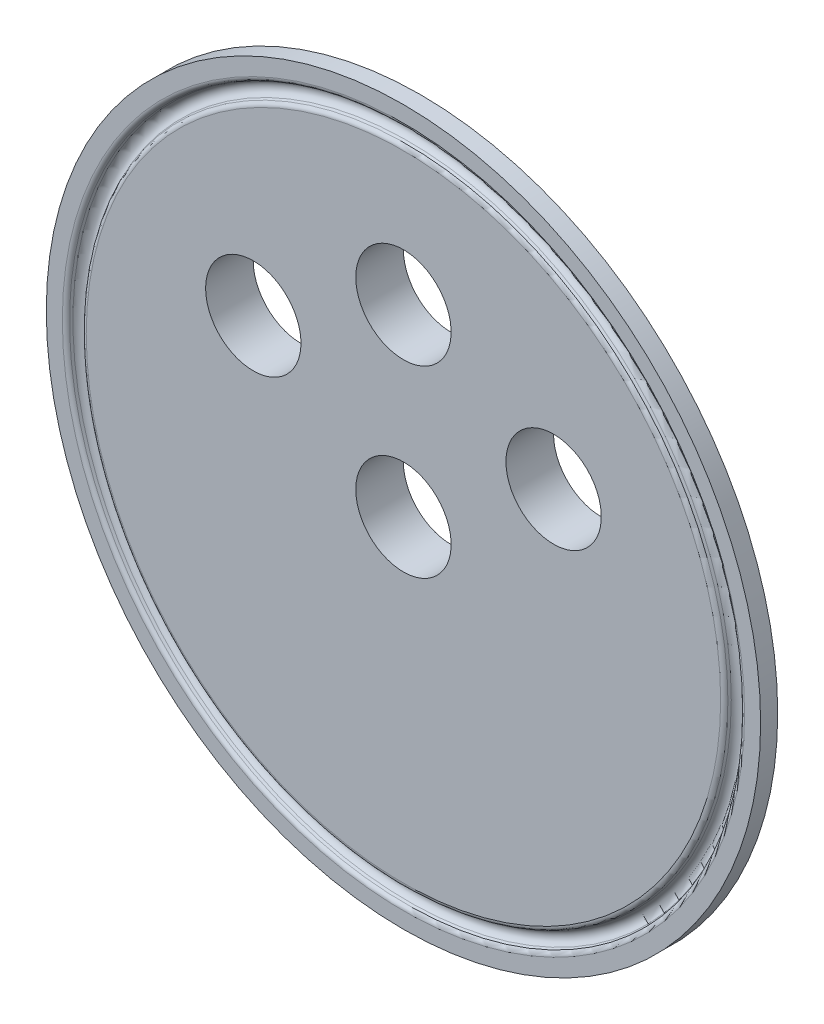
ISO-10303-21;
HEADER;
FILE_DESCRIPTION(('STEP AP214'),'2;1');
FILE_NAME('part.step','',(''),(''),'','','');
FILE_SCHEMA(('AUTOMOTIVE_DESIGN { 1 0 10303 214 1 1 1 1 }'));
ENDSEC;
DATA;
#1=APPLICATION_CONTEXT('core data for automotive mechanical design processes');
#2=APPLICATION_PROTOCOL_DEFINITION('international standard','automotive_design',2000,#1);
#3=PRODUCT_CONTEXT('',#1,'mechanical');
#4=PRODUCT('Part','Part','',(#3));
#5=PRODUCT_RELATED_PRODUCT_CATEGORY('part','',(#4));
#6=PRODUCT_DEFINITION_FORMATION('','',#4);
#7=PRODUCT_DEFINITION_CONTEXT('part definition',#1,'design');
#8=PRODUCT_DEFINITION('design','',#6,#7);
#9=PRODUCT_DEFINITION_SHAPE('','',#8);
#10=(LENGTH_UNIT() NAMED_UNIT(*) SI_UNIT(.MILLI.,.METRE.));
#11=(NAMED_UNIT(*) PLANE_ANGLE_UNIT() SI_UNIT($,.RADIAN.));
#12=(NAMED_UNIT(*) SI_UNIT($,.STERADIAN.) SOLID_ANGLE_UNIT());
#13=UNCERTAINTY_MEASURE_WITH_UNIT(LENGTH_MEASURE(1.E-05),#10,'distance_accuracy_value','');
#14=(GEOMETRIC_REPRESENTATION_CONTEXT(3) GLOBAL_UNCERTAINTY_ASSIGNED_CONTEXT((#13)) GLOBAL_UNIT_ASSIGNED_CONTEXT((#10,
#11,#12)) REPRESENTATION_CONTEXT('',''));
#15=CARTESIAN_POINT('',(0.,0.,0.));
#16=DIRECTION('',(0.,0.,1.));
#17=DIRECTION('',(1.,0.,0.));
#18=AXIS2_PLACEMENT_3D('',#15,#16,#17);
#19=CARTESIAN_POINT('',(0.,45.5042147091706,-7.9248));
#20=DIRECTION('',(0.,0.,1.));
#21=DIRECTION('',(1.,0.,0.));
#22=AXIS2_PLACEMENT_3D('',#19,#20,#21);
#23=PLANE('',#22);
#24=CARTESIAN_POINT('',(25.,16.5,-7.9248));
#25=DIRECTION('',(0.,0.,-1.));
#26=DIRECTION('',(-1.,0.,0.));
#27=AXIS2_PLACEMENT_3D('',#24,#25,#26);
#28=CIRCLE('',#27,7.9375);
#29=CARTESIAN_POINT('',(17.0625,16.5,-7.9248));
#30=VERTEX_POINT('',#29);
#31=EDGE_CURVE('E98',#30,#30,#28,.T.);
#32=ORIENTED_EDGE('',*,*,#31,.F.);
#33=EDGE_LOOP('',(#32));
#34=FACE_BOUND('',#33,.T.);
#35=CARTESIAN_POINT('',(0.,0.,-7.9248));
#36=DIRECTION('',(0.,0.,-1.));
#37=DIRECTION('',(-1.,0.,0.));
#38=AXIS2_PLACEMENT_3D('',#35,#36,#37);
#39=CIRCLE('',#38,7.9375);
#40=CARTESIAN_POINT('',(-7.9375,0.,-7.9248));
#41=VERTEX_POINT('',#40);
#42=EDGE_CURVE('E106',#41,#41,#39,.T.);
#43=ORIENTED_EDGE('',*,*,#42,.F.);
#44=EDGE_LOOP('',(#43));
#45=FACE_BOUND('',#44,.T.);
#46=CARTESIAN_POINT('',(-25.,16.5,-7.9248));
#47=DIRECTION('',(0.,0.,-1.));
#48=DIRECTION('',(-1.,0.,0.));
#49=AXIS2_PLACEMENT_3D('',#46,#47,#48);
#50=CIRCLE('',#49,7.9375);
#51=CARTESIAN_POINT('',(-32.9375,16.5,-7.9248));
#52=VERTEX_POINT('',#51);
#53=EDGE_CURVE('E90',#52,#52,#50,.T.);
#54=ORIENTED_EDGE('',*,*,#53,.F.);
#55=EDGE_LOOP('',(#54));
#56=FACE_BOUND('',#55,.T.);
#57=CARTESIAN_POINT('',(0.,30.6,-7.9248));
#58=DIRECTION('',(0.,0.,-1.));
#59=DIRECTION('',(-1.,0.,0.));
#60=AXIS2_PLACEMENT_3D('',#57,#58,#59);
#61=CIRCLE('',#60,7.9375);
#62=CARTESIAN_POINT('',(-7.9375,30.6,-7.9248));
#63=VERTEX_POINT('',#62);
#64=EDGE_CURVE('E86',#63,#63,#61,.T.);
#65=ORIENTED_EDGE('',*,*,#64,.F.);
#66=EDGE_LOOP('',(#65));
#67=FACE_BOUND('',#66,.T.);
#68=CARTESIAN_POINT('',(0.,0.,-7.9248));
#69=DIRECTION('',(0.,0.,1.));
#70=DIRECTION('',(1.,0.,0.));
#71=AXIS2_PLACEMENT_3D('',#68,#69,#70);
#72=CIRCLE('',#71,45.5042147091706);
#73=CARTESIAN_POINT('',(45.5042147091706,0.,-7.9248));
#74=VERTEX_POINT('',#73);
#75=EDGE_CURVE('E10',#74,#74,#72,.T.);
#76=ORIENTED_EDGE('',*,*,#75,.F.);
#77=EDGE_LOOP('',(#76));
#78=FACE_BOUND('',#77,.T.);
#79=ADVANCED_FACE('F42',(#34,#45,#56,#67,#78),#23,.F.);
#80=CARTESIAN_POINT('',(0.,0.,-7.9248));
#81=DIRECTION('',(0.,0.,1.));
#82=DIRECTION('',(1.,0.,0.));
#83=AXIS2_PLACEMENT_3D('',#80,#81,#82);
#84=CONICAL_SURFACE('',#83,45.5042147091706,1.22173047639603);
#85=CARTESIAN_POINT('',(0.,0.,-2.8448));
#86=DIRECTION('',(0.,0.,1.));
#87=DIRECTION('',(1.,0.,0.));
#88=AXIS2_PLACEMENT_3D('',#85,#86,#87);
#89=CIRCLE('',#88,59.4614);
#90=CARTESIAN_POINT('',(59.4614,0.,-2.8448));
#91=VERTEX_POINT('',#90);
#92=EDGE_CURVE('E49',#91,#91,#89,.T.);
#93=ORIENTED_EDGE('',*,*,#92,.F.);
#94=EDGE_LOOP('',(#93));
#95=FACE_BOUND('',#94,.T.);
#96=ORIENTED_EDGE('',*,*,#75,.T.);
#97=EDGE_LOOP('',(#96));
#98=FACE_BOUND('',#97,.T.);
#99=ADVANCED_FACE('F122',(#95,#98),#84,.T.);
#100=CARTESIAN_POINT('',(0.,0.,0.));
#101=DIRECTION('',(0.,0.,1.));
#102=DIRECTION('',(1.,0.,0.));
#103=AXIS2_PLACEMENT_3D('',#100,#101,#102);
#104=CYLINDRICAL_SURFACE('',#103,59.4614);
#105=CARTESIAN_POINT('',(0.,0.,0.));
#106=DIRECTION('',(0.,0.,1.));
#107=DIRECTION('',(1.,0.,0.));
#108=AXIS2_PLACEMENT_3D('',#105,#106,#107);
#109=CIRCLE('',#108,59.4614);
#110=CARTESIAN_POINT('',(59.4614,0.,0.));
#111=VERTEX_POINT('',#110);
#112=EDGE_CURVE('E54',#111,#111,#109,.T.);
#113=ORIENTED_EDGE('',*,*,#112,.F.);
#114=EDGE_LOOP('',(#113));
#115=FACE_BOUND('',#114,.T.);
#116=ORIENTED_EDGE('',*,*,#92,.T.);
#117=EDGE_LOOP('',(#116));
#118=FACE_BOUND('',#117,.T.);
#119=ADVANCED_FACE('F170',(#115,#118),#104,.T.);
#120=CARTESIAN_POINT('',(0.,56.7910722747395,0.));
#121=DIRECTION('',(0.,0.,-1.));
#122=DIRECTION('',(-1.,0.,0.));
#123=AXIS2_PLACEMENT_3D('',#120,#121,#122);
#124=PLANE('',#123);
#125=CARTESIAN_POINT('',(0.,0.,0.));
#126=DIRECTION('',(0.,0.,1.));
#127=DIRECTION('',(1.,0.,0.));
#128=AXIS2_PLACEMENT_3D('',#125,#126,#127);
#129=CIRCLE('',#128,56.7910722747395);
#130=CARTESIAN_POINT('',(56.7910722747395,0.,0.));
#131=VERTEX_POINT('',#130);
#132=EDGE_CURVE('E59',#131,#131,#129,.T.);
#133=ORIENTED_EDGE('',*,*,#132,.F.);
#134=EDGE_LOOP('',(#133));
#135=FACE_BOUND('',#134,.T.);
#136=ORIENTED_EDGE('',*,*,#112,.T.);
#137=EDGE_LOOP('',(#136));
#138=FACE_BOUND('',#137,.T.);
#139=ADVANCED_FACE('F166',(#135,#138),#124,.F.);
#140=CARTESIAN_POINT('',(0.,0.,-0.7874));
#141=DIRECTION('',(0.,0.,1.));
#142=DIRECTION('',(1.,0.,0.));
#143=AXIS2_PLACEMENT_3D('',#140,#141,#142);
#144=TOROIDAL_SURFACE('',#143,56.7910722747395,0.7874);
#145=CARTESIAN_POINT('',(0.,0.,-0.479738309427547));
#146=DIRECTION('',(0.,0.,1.));
#147=DIRECTION('',(1.,0.,0.));
#148=AXIS2_PLACEMENT_3D('',#145,#146,#147);
#149=CIRCLE('',#148,56.0662667531311);
#150=CARTESIAN_POINT('',(56.0662667531311,0.,-0.479738309427547));
#151=VERTEX_POINT('',#150);
#152=EDGE_CURVE('E65',#151,#151,#149,.T.);
#153=ORIENTED_EDGE('',*,*,#152,.F.);
#154=EDGE_LOOP('',(#153));
#155=FACE_BOUND('',#154,.T.);
#156=ORIENTED_EDGE('',*,*,#132,.T.);
#157=EDGE_LOOP('',(#156));
#158=FACE_BOUND('',#157,.T.);
#159=ADVANCED_FACE('F162',(#155,#158),#144,.T.);
#160=CARTESIAN_POINT('',(0.,0.,-0.479738309427547));
#161=DIRECTION('',(0.,0.,1.));
#162=DIRECTION('',(1.,0.,0.));
#163=AXIS2_PLACEMENT_3D('',#160,#161,#162);
#164=CONICAL_SURFACE('',#163,56.0662667531311,0.401425727958702);
#165=CARTESIAN_POINT('',(0.,0.,-0.872854821190493));
#166=DIRECTION('',(0.,0.,1.));
#167=DIRECTION('',(1.,0.,0.));
#168=AXIS2_PLACEMENT_3D('',#165,#166,#167);
#169=CIRCLE('',#168,55.8993986940515);
#170=CARTESIAN_POINT('',(55.8993986940515,0.,-0.872854821190493));
#171=VERTEX_POINT('',#170);
#172=EDGE_CURVE('E69',#171,#171,#169,.T.);
#173=ORIENTED_EDGE('',*,*,#172,.F.);
#174=EDGE_LOOP('',(#173));
#175=FACE_BOUND('',#174,.T.);
#176=ORIENTED_EDGE('',*,*,#152,.T.);
#177=EDGE_LOOP('',(#176));
#178=FACE_BOUND('',#177,.T.);
#179=ADVANCED_FACE('F158',(#175,#178),#164,.F.);
#180=CARTESIAN_POINT('',(0.,0.,-0.4064));
#181=DIRECTION('',(0.,0.,1.));
#182=DIRECTION('',(1.,0.,0.));
#183=AXIS2_PLACEMENT_3D('',#180,#181,#182);
#184=TOROIDAL_SURFACE('',#183,54.8005,1.1938);
#185=CARTESIAN_POINT('',(0.,0.,-0.872854821190503));
#186=DIRECTION('',(0.,0.,1.));
#187=DIRECTION('',(1.,0.,0.));
#188=AXIS2_PLACEMENT_3D('',#185,#186,#187);
#189=CIRCLE('',#188,53.7016013059485);
#190=CARTESIAN_POINT('',(53.7016013059485,0.,-0.872854821190503));
#191=VERTEX_POINT('',#190);
#192=EDGE_CURVE('E73',#191,#191,#189,.T.);
#193=ORIENTED_EDGE('',*,*,#192,.F.);
#194=EDGE_LOOP('',(#193));
#195=FACE_BOUND('',#194,.T.);
#196=ORIENTED_EDGE('',*,*,#172,.T.);
#197=EDGE_LOOP('',(#196));
#198=FACE_BOUND('',#197,.T.);
#199=ADVANCED_FACE('F154',(#195,#198),#184,.F.);
#200=CARTESIAN_POINT('',(0.,0.,-0.872854821190503));
#201=DIRECTION('',(0.,0.,-1.));
#202=DIRECTION('',(-1.,0.,0.));
#203=AXIS2_PLACEMENT_3D('',#200,#201,#202);
#204=CONICAL_SURFACE('',#203,53.7016013059485,0.401425727958718);
#205=CARTESIAN_POINT('',(0.,0.,-0.479738309427541));
#206=DIRECTION('',(0.,0.,1.));
#207=DIRECTION('',(1.,0.,0.));
#208=AXIS2_PLACEMENT_3D('',#205,#206,#207);
#209=CIRCLE('',#208,53.5347332468689);
#210=CARTESIAN_POINT('',(53.5347332468689,0.,-0.479738309427541));
#211=VERTEX_POINT('',#210);
#212=EDGE_CURVE('E77',#211,#211,#209,.T.);
#213=ORIENTED_EDGE('',*,*,#212,.F.);
#214=EDGE_LOOP('',(#213));
#215=FACE_BOUND('',#214,.T.);
#216=ORIENTED_EDGE('',*,*,#192,.T.);
#217=EDGE_LOOP('',(#216));
#218=FACE_BOUND('',#217,.T.);
#219=ADVANCED_FACE('F150',(#215,#218),#204,.T.);
#220=CARTESIAN_POINT('',(0.,0.,-0.7874));
#221=DIRECTION('',(0.,0.,1.));
#222=DIRECTION('',(1.,0.,0.));
#223=AXIS2_PLACEMENT_3D('',#220,#221,#222);
#224=TOROIDAL_SURFACE('',#223,52.8099277252605,0.787400000000005);
#225=CARTESIAN_POINT('',(0.,0.,0.));
#226=DIRECTION('',(0.,0.,1.));
#227=DIRECTION('',(1.,0.,0.));
#228=AXIS2_PLACEMENT_3D('',#225,#226,#227);
#229=CIRCLE('',#228,52.8099277252605);
#230=CARTESIAN_POINT('',(52.8099277252605,0.,0.));
#231=VERTEX_POINT('',#230);
#232=EDGE_CURVE('E81',#231,#231,#229,.T.);
#233=ORIENTED_EDGE('',*,*,#232,.F.);
#234=EDGE_LOOP('',(#233));
#235=FACE_BOUND('',#234,.T.);
#236=ORIENTED_EDGE('',*,*,#212,.T.);
#237=EDGE_LOOP('',(#236));
#238=FACE_BOUND('',#237,.T.);
#239=ADVANCED_FACE('F140',(#235,#238),#224,.T.);
#240=CARTESIAN_POINT('',(0.,0.,0.));
#241=DIRECTION('',(0.,0.,-1.));
#242=DIRECTION('',(-1.,0.,0.));
#243=AXIS2_PLACEMENT_3D('',#240,#241,#242);
#244=PLANE('',#243);
#245=CARTESIAN_POINT('',(25.,16.5,0.));
#246=DIRECTION('',(0.,0.,-1.));
#247=DIRECTION('',(-1.,0.,0.));
#248=AXIS2_PLACEMENT_3D('',#245,#246,#247);
#249=CIRCLE('',#248,7.9375);
#250=CARTESIAN_POINT('',(17.0625,16.5,0.));
#251=VERTEX_POINT('',#250);
#252=EDGE_CURVE('E94',#251,#251,#249,.T.);
#253=ORIENTED_EDGE('',*,*,#252,.T.);
#254=EDGE_LOOP('',(#253));
#255=FACE_BOUND('',#254,.T.);
#256=CARTESIAN_POINT('',(0.,0.,0.));
#257=DIRECTION('',(0.,0.,-1.));
#258=DIRECTION('',(-1.,0.,0.));
#259=AXIS2_PLACEMENT_3D('',#256,#257,#258);
#260=CIRCLE('',#259,7.9375);
#261=CARTESIAN_POINT('',(-7.9375,0.,0.));
#262=VERTEX_POINT('',#261);
#263=EDGE_CURVE('E102',#262,#262,#260,.T.);
#264=ORIENTED_EDGE('',*,*,#263,.T.);
#265=EDGE_LOOP('',(#264));
#266=FACE_BOUND('',#265,.T.);
#267=CARTESIAN_POINT('',(-25.,16.5,0.));
#268=DIRECTION('',(0.,0.,-1.));
#269=DIRECTION('',(-1.,0.,0.));
#270=AXIS2_PLACEMENT_3D('',#267,#268,#269);
#271=CIRCLE('',#270,7.9375);
#272=CARTESIAN_POINT('',(-32.9375,16.5,0.));
#273=VERTEX_POINT('',#272);
#274=EDGE_CURVE('E110',#273,#273,#271,.T.);
#275=ORIENTED_EDGE('',*,*,#274,.T.);
#276=EDGE_LOOP('',(#275));
#277=FACE_BOUND('',#276,.T.);
#278=CARTESIAN_POINT('',(0.,30.6,0.));
#279=DIRECTION('',(0.,0.,-1.));
#280=DIRECTION('',(-1.,0.,0.));
#281=AXIS2_PLACEMENT_3D('',#278,#279,#280);
#282=CIRCLE('',#281,7.9375);
#283=CARTESIAN_POINT('',(-7.9375,30.6,0.));
#284=VERTEX_POINT('',#283);
#285=EDGE_CURVE('E85',#284,#284,#282,.T.);
#286=ORIENTED_EDGE('',*,*,#285,.T.);
#287=EDGE_LOOP('',(#286));
#288=FACE_BOUND('',#287,.T.);
#289=ORIENTED_EDGE('',*,*,#232,.T.);
#290=EDGE_LOOP('',(#289));
#291=FACE_BOUND('',#290,.T.);
#292=ADVANCED_FACE('F129',(#255,#266,#277,#288,#291),#244,.F.);
#293=CARTESIAN_POINT('',(0.,30.6,0.));
#294=DIRECTION('',(0.,0.,-1.));
#295=DIRECTION('',(-1.,0.,0.));
#296=AXIS2_PLACEMENT_3D('',#293,#294,#295);
#297=CYLINDRICAL_SURFACE('',#296,7.9375);
#298=ORIENTED_EDGE('',*,*,#285,.F.);
#299=EDGE_LOOP('',(#298));
#300=FACE_BOUND('',#299,.T.);
#301=ORIENTED_EDGE('',*,*,#64,.T.);
#302=EDGE_LOOP('',(#301));
#303=FACE_BOUND('',#302,.T.);
#304=ADVANCED_FACE('F127',(#300,#303),#297,.F.);
#305=CARTESIAN_POINT('',(-25.,16.5,0.));
#306=DIRECTION('',(0.,0.,-1.));
#307=DIRECTION('',(-1.,0.,0.));
#308=AXIS2_PLACEMENT_3D('',#305,#306,#307);
#309=CYLINDRICAL_SURFACE('',#308,7.9375);
#310=ORIENTED_EDGE('',*,*,#274,.F.);
#311=EDGE_LOOP('',(#310));
#312=FACE_BOUND('',#311,.T.);
#313=ORIENTED_EDGE('',*,*,#53,.T.);
#314=EDGE_LOOP('',(#313));
#315=FACE_BOUND('',#314,.T.);
#316=ADVANCED_FACE('F118',(#312,#315),#309,.F.);
#317=CARTESIAN_POINT('',(0.,0.,0.));
#318=DIRECTION('',(0.,0.,-1.));
#319=DIRECTION('',(-1.,0.,0.));
#320=AXIS2_PLACEMENT_3D('',#317,#318,#319);
#321=CYLINDRICAL_SURFACE('',#320,7.9375);
#322=ORIENTED_EDGE('',*,*,#263,.F.);
#323=EDGE_LOOP('',(#322));
#324=FACE_BOUND('',#323,.T.);
#325=ORIENTED_EDGE('',*,*,#42,.T.);
#326=EDGE_LOOP('',(#325));
#327=FACE_BOUND('',#326,.T.);
#328=ADVANCED_FACE('F136',(#324,#327),#321,.F.);
#329=CARTESIAN_POINT('',(25.,16.5,0.));
#330=DIRECTION('',(0.,0.,-1.));
#331=DIRECTION('',(-1.,0.,0.));
#332=AXIS2_PLACEMENT_3D('',#329,#330,#331);
#333=CYLINDRICAL_SURFACE('',#332,7.9375);
#334=ORIENTED_EDGE('',*,*,#252,.F.);
#335=EDGE_LOOP('',(#334));
#336=FACE_BOUND('',#335,.T.);
#337=ORIENTED_EDGE('',*,*,#31,.T.);
#338=EDGE_LOOP('',(#337));
#339=FACE_BOUND('',#338,.T.);
#340=ADVANCED_FACE('F145',(#336,#339),#333,.F.);
#341=CLOSED_SHELL('',(#79,#99,#119,#139,#159,#179,#199,#219,#239,#292,#304,#316,#328,#340));
#342=MANIFOLD_SOLID_BREP('B2',#341);
#343=ADVANCED_BREP_SHAPE_REPRESENTATION('',(#18,#342),#14);
#344=SHAPE_DEFINITION_REPRESENTATION(#9,#343);
ENDSEC;
END-ISO-10303-21;
